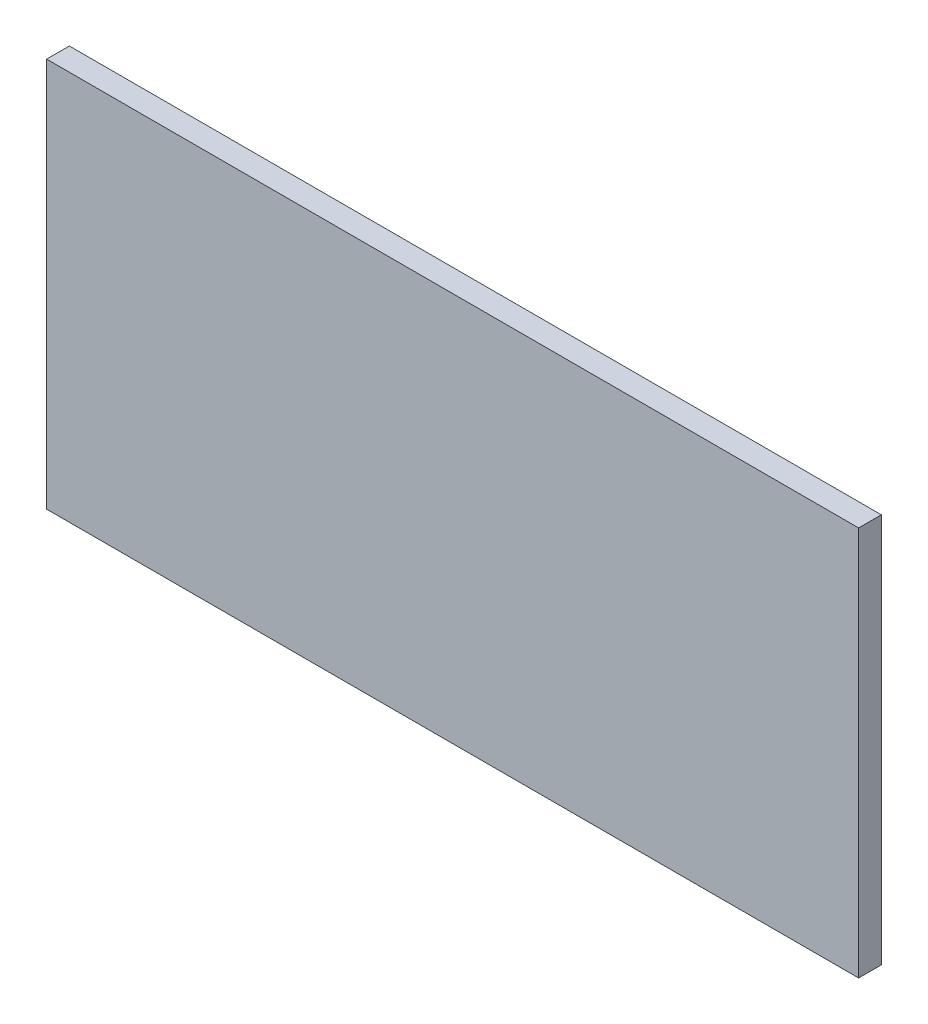
ISO-10303-21;
HEADER;
FILE_DESCRIPTION(('STEP AP214'),'2;1');
FILE_NAME('part.step','',(''),(''),'','','');
FILE_SCHEMA(('AUTOMOTIVE_DESIGN { 1 0 10303 214 1 1 1 1 }'));
ENDSEC;
DATA;
#1=APPLICATION_CONTEXT('core data for automotive mechanical design processes');
#2=APPLICATION_PROTOCOL_DEFINITION('international standard','automotive_design',2000,#1);
#3=PRODUCT_CONTEXT('',#1,'mechanical');
#4=PRODUCT('Part','Part','',(#3));
#5=PRODUCT_RELATED_PRODUCT_CATEGORY('part','',(#4));
#6=PRODUCT_DEFINITION_FORMATION('','',#4);
#7=PRODUCT_DEFINITION_CONTEXT('part definition',#1,'design');
#8=PRODUCT_DEFINITION('design','',#6,#7);
#9=PRODUCT_DEFINITION_SHAPE('','',#8);
#10=(LENGTH_UNIT() NAMED_UNIT(*) SI_UNIT(.MILLI.,.METRE.));
#11=(NAMED_UNIT(*) PLANE_ANGLE_UNIT() SI_UNIT($,.RADIAN.));
#12=(NAMED_UNIT(*) SI_UNIT($,.STERADIAN.) SOLID_ANGLE_UNIT());
#13=UNCERTAINTY_MEASURE_WITH_UNIT(LENGTH_MEASURE(1.E-05),#10,'distance_accuracy_value','');
#14=(GEOMETRIC_REPRESENTATION_CONTEXT(3) GLOBAL_UNCERTAINTY_ASSIGNED_CONTEXT((#13)) GLOBAL_UNIT_ASSIGNED_CONTEXT((#10,
#11,#12)) REPRESENTATION_CONTEXT('',''));
#15=CARTESIAN_POINT('',(0.,0.,0.));
#16=DIRECTION('',(0.,0.,1.));
#17=DIRECTION('',(1.,0.,0.));
#18=AXIS2_PLACEMENT_3D('',#15,#16,#17);
#19=CARTESIAN_POINT('',(99.616,-98.366,1.635));
#20=DIRECTION('',(0.,0.,-1.));
#21=DIRECTION('',(0.,-1.,0.));
#22=AXIS2_PLACEMENT_3D('',#19,#20,#21);
#23=PLANE('',#22);
#24=DIRECTION('',(0.,-1.,0.));
#25=VECTOR('',#24,1.);
#26=CARTESIAN_POINT('',(100.241,-98.066,1.635));
#27=LINE('',#26,#25);
#28=CARTESIAN_POINT('',(100.241,-98.066,1.635));
#29=VERTEX_POINT('',#28);
#30=CARTESIAN_POINT('',(100.241,-98.666,1.635));
#31=VERTEX_POINT('',#30);
#32=EDGE_CURVE('E26',#29,#31,#27,.T.);
#33=ORIENTED_EDGE('',*,*,#32,.F.);
#34=DIRECTION('',(1.,0.,0.));
#35=VECTOR('',#34,1.);
#36=CARTESIAN_POINT('',(98.991,-98.066,1.635));
#37=LINE('',#36,#35);
#38=CARTESIAN_POINT('',(98.991,-98.066,1.635));
#39=VERTEX_POINT('',#38);
#40=EDGE_CURVE('E106',#39,#29,#37,.T.);
#41=ORIENTED_EDGE('',*,*,#40,.F.);
#42=DIRECTION('',(0.,1.,0.));
#43=VECTOR('',#42,1.);
#44=CARTESIAN_POINT('',(98.991,-98.666,1.635));
#45=LINE('',#44,#43);
#46=CARTESIAN_POINT('',(98.991,-98.666,1.635));
#47=VERTEX_POINT('',#46);
#48=EDGE_CURVE('E78',#47,#39,#45,.T.);
#49=ORIENTED_EDGE('',*,*,#48,.F.);
#50=DIRECTION('',(-1.,0.,0.));
#51=VECTOR('',#50,1.);
#52=CARTESIAN_POINT('',(100.241,-98.666,1.635));
#53=LINE('',#52,#51);
#54=EDGE_CURVE('E76',#31,#47,#53,.T.);
#55=ORIENTED_EDGE('',*,*,#54,.F.);
#56=EDGE_LOOP('',(#33,#41,#49,#55));
#57=FACE_BOUND('',#56,.T.);
#58=ADVANCED_FACE('F17',(#57),#23,.F.);
#59=CARTESIAN_POINT('',(99.616,-98.366,1.6));
#60=DIRECTION('',(0.,0.,-1.));
#61=DIRECTION('',(0.,-1.,0.));
#62=AXIS2_PLACEMENT_3D('',#59,#60,#61);
#63=PLANE('',#62);
#64=DIRECTION('',(-1.,0.,0.));
#65=VECTOR('',#64,1.);
#66=CARTESIAN_POINT('',(100.241,-98.666,1.6));
#67=LINE('',#66,#65);
#68=CARTESIAN_POINT('',(100.241,-98.666,1.6));
#69=VERTEX_POINT('',#68);
#70=CARTESIAN_POINT('',(98.991,-98.666,1.6));
#71=VERTEX_POINT('',#70);
#72=EDGE_CURVE('E88',#69,#71,#67,.T.);
#73=ORIENTED_EDGE('',*,*,#72,.T.);
#74=DIRECTION('',(0.,1.,0.));
#75=VECTOR('',#74,1.);
#76=CARTESIAN_POINT('',(98.991,-98.666,1.6));
#77=LINE('',#76,#75);
#78=CARTESIAN_POINT('',(98.991,-98.066,1.6));
#79=VERTEX_POINT('',#78);
#80=EDGE_CURVE('E105',#71,#79,#77,.T.);
#81=ORIENTED_EDGE('',*,*,#80,.T.);
#82=DIRECTION('',(1.,0.,0.));
#83=VECTOR('',#82,1.);
#84=CARTESIAN_POINT('',(98.991,-98.066,1.6));
#85=LINE('',#84,#83);
#86=CARTESIAN_POINT('',(100.241,-98.066,1.6));
#87=VERTEX_POINT('',#86);
#88=EDGE_CURVE('E74',#79,#87,#85,.T.);
#89=ORIENTED_EDGE('',*,*,#88,.T.);
#90=DIRECTION('',(0.,-1.,0.));
#91=VECTOR('',#90,1.);
#92=CARTESIAN_POINT('',(100.241,-98.066,1.6));
#93=LINE('',#92,#91);
#94=EDGE_CURVE('E11',#87,#69,#93,.T.);
#95=ORIENTED_EDGE('',*,*,#94,.T.);
#96=EDGE_LOOP('',(#73,#81,#89,#95));
#97=FACE_BOUND('',#96,.T.);
#98=ADVANCED_FACE('F19',(#97),#63,.T.);
#99=CARTESIAN_POINT('',(100.241,-98.066,1.6));
#100=DIRECTION('',(1.,0.,0.));
#101=DIRECTION('',(0.,1.,0.));
#102=AXIS2_PLACEMENT_3D('',#99,#100,#101);
#103=PLANE('',#102);
#104=DIRECTION('',(0.,0.,1.));
#105=VECTOR('',#104,1.);
#106=CARTESIAN_POINT('',(100.241,-98.066,1.6));
#107=LINE('',#106,#105);
#108=EDGE_CURVE('E71',#87,#29,#107,.T.);
#109=ORIENTED_EDGE('',*,*,#108,.T.);
#110=ORIENTED_EDGE('',*,*,#32,.T.);
#111=DIRECTION('',(0.,0.,1.));
#112=VECTOR('',#111,1.);
#113=CARTESIAN_POINT('',(100.241,-98.666,1.6));
#114=LINE('',#113,#112);
#115=EDGE_CURVE('E69',#69,#31,#114,.T.);
#116=ORIENTED_EDGE('',*,*,#115,.F.);
#117=ORIENTED_EDGE('',*,*,#94,.F.);
#118=EDGE_LOOP('',(#109,#110,#116,#117));
#119=FACE_BOUND('',#118,.T.);
#120=ADVANCED_FACE('F67',(#119),#103,.T.);
#121=CARTESIAN_POINT('',(98.991,-98.066,1.6));
#122=DIRECTION('',(0.,1.,0.));
#123=DIRECTION('',(1.,0.,0.));
#124=AXIS2_PLACEMENT_3D('',#121,#122,#123);
#125=PLANE('',#124);
#126=DIRECTION('',(0.,0.,1.));
#127=VECTOR('',#126,1.);
#128=CARTESIAN_POINT('',(98.991,-98.066,1.6));
#129=LINE('',#128,#127);
#130=EDGE_CURVE('E101',#79,#39,#129,.T.);
#131=ORIENTED_EDGE('',*,*,#130,.T.);
#132=ORIENTED_EDGE('',*,*,#40,.T.);
#133=ORIENTED_EDGE('',*,*,#108,.F.);
#134=ORIENTED_EDGE('',*,*,#88,.F.);
#135=EDGE_LOOP('',(#131,#132,#133,#134));
#136=FACE_BOUND('',#135,.T.);
#137=ADVANCED_FACE('F120',(#136),#125,.T.);
#138=CARTESIAN_POINT('',(98.991,-98.666,1.6));
#139=DIRECTION('',(-1.,0.,0.));
#140=DIRECTION('',(0.,0.,1.));
#141=AXIS2_PLACEMENT_3D('',#138,#139,#140);
#142=PLANE('',#141);
#143=DIRECTION('',(0.,0.,1.));
#144=VECTOR('',#143,1.);
#145=CARTESIAN_POINT('',(98.991,-98.666,1.6));
#146=LINE('',#145,#144);
#147=EDGE_CURVE('E83',#71,#47,#146,.T.);
#148=ORIENTED_EDGE('',*,*,#147,.T.);
#149=ORIENTED_EDGE('',*,*,#48,.T.);
#150=ORIENTED_EDGE('',*,*,#130,.F.);
#151=ORIENTED_EDGE('',*,*,#80,.F.);
#152=EDGE_LOOP('',(#148,#149,#150,#151));
#153=FACE_BOUND('',#152,.T.);
#154=ADVANCED_FACE('F122',(#153),#142,.T.);
#155=CARTESIAN_POINT('',(100.241,-98.666,1.6));
#156=DIRECTION('',(0.,-1.,0.));
#157=DIRECTION('',(0.,0.,-1.));
#158=AXIS2_PLACEMENT_3D('',#155,#156,#157);
#159=PLANE('',#158);
#160=ORIENTED_EDGE('',*,*,#115,.T.);
#161=ORIENTED_EDGE('',*,*,#54,.T.);
#162=ORIENTED_EDGE('',*,*,#147,.F.);
#163=ORIENTED_EDGE('',*,*,#72,.F.);
#164=EDGE_LOOP('',(#160,#161,#162,#163));
#165=FACE_BOUND('',#164,.T.);
#166=ADVANCED_FACE('F86',(#165),#159,.T.);
#167=CLOSED_SHELL('',(#58,#98,#120,#137,#154,#166));
#168=MANIFOLD_SOLID_BREP('B1',#167);
#169=ADVANCED_BREP_SHAPE_REPRESENTATION('',(#18,#168),#14);
#170=SHAPE_DEFINITION_REPRESENTATION(#9,#169);
ENDSEC;
END-ISO-10303-21;
